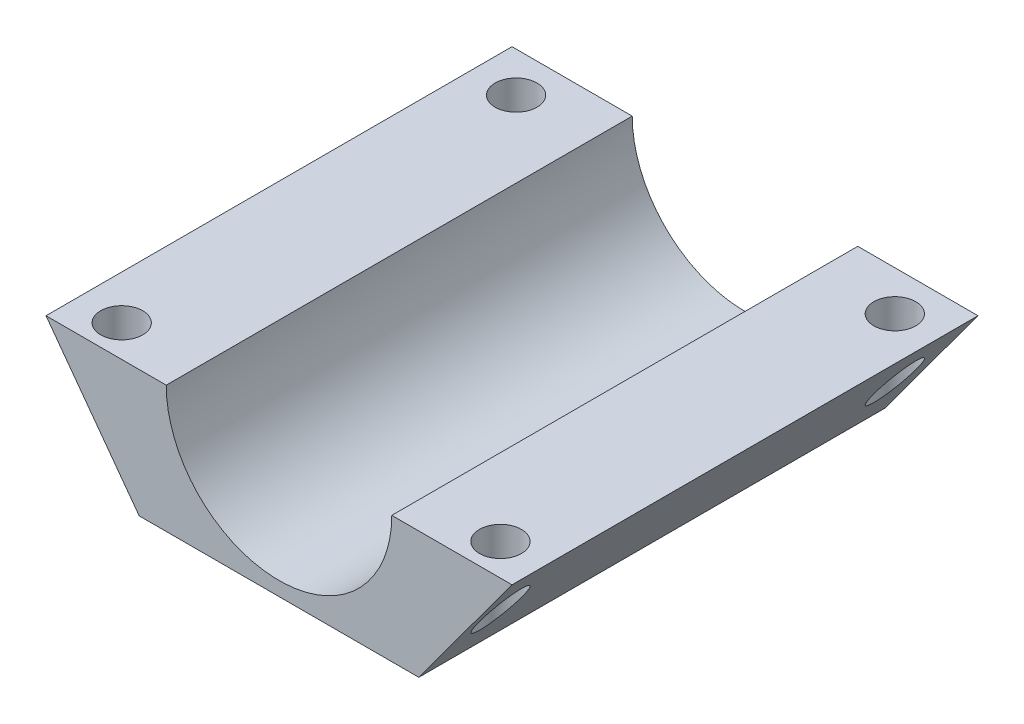
ISO-10303-21;
HEADER;
FILE_DESCRIPTION(('STEP AP214'),'2;1');
FILE_NAME('part.step','',(''),(''),'','','');
FILE_SCHEMA(('AUTOMOTIVE_DESIGN { 1 0 10303 214 1 1 1 1 }'));
ENDSEC;
DATA;
#1=APPLICATION_CONTEXT('core data for automotive mechanical design processes');
#2=APPLICATION_PROTOCOL_DEFINITION('international standard','automotive_design',2000,#1);
#3=PRODUCT_CONTEXT('',#1,'mechanical');
#4=PRODUCT('Part','Part','',(#3));
#5=PRODUCT_RELATED_PRODUCT_CATEGORY('part','',(#4));
#6=PRODUCT_DEFINITION_FORMATION('','',#4);
#7=PRODUCT_DEFINITION_CONTEXT('part definition',#1,'design');
#8=PRODUCT_DEFINITION('design','',#6,#7);
#9=PRODUCT_DEFINITION_SHAPE('','',#8);
#10=(LENGTH_UNIT() NAMED_UNIT(*) SI_UNIT(.MILLI.,.METRE.));
#11=(NAMED_UNIT(*) PLANE_ANGLE_UNIT() SI_UNIT($,.RADIAN.));
#12=(NAMED_UNIT(*) SI_UNIT($,.STERADIAN.) SOLID_ANGLE_UNIT());
#13=UNCERTAINTY_MEASURE_WITH_UNIT(LENGTH_MEASURE(1.E-05),#10,'distance_accuracy_value','');
#14=(GEOMETRIC_REPRESENTATION_CONTEXT(3) GLOBAL_UNCERTAINTY_ASSIGNED_CONTEXT((#13)) GLOBAL_UNIT_ASSIGNED_CONTEXT((#10,
#11,#12)) REPRESENTATION_CONTEXT('',''));
#15=CARTESIAN_POINT('',(0.,0.,0.));
#16=DIRECTION('',(0.,0.,1.));
#17=DIRECTION('',(1.,0.,0.));
#18=AXIS2_PLACEMENT_3D('',#15,#16,#17);
#19=CARTESIAN_POINT('',(0.,0.,0.));
#20=DIRECTION('',(0.,1.,0.));
#21=DIRECTION('',(-1.,0.,0.));
#22=AXIS2_PLACEMENT_3D('',#19,#20,#21);
#23=PLANE('',#22);
#24=CARTESIAN_POINT('',(-20.282339383463,0.,4.27991228451974));
#25=DIRECTION('',(0.,1.,0.));
#26=DIRECTION('',(-1.,0.,0.));
#27=AXIS2_PLACEMENT_3D('',#24,#25,#26);
#28=CIRCLE('',#27,2.25);
#29=CARTESIAN_POINT('',(-22.532339383463,0.,4.27991228451974));
#30=VERTEX_POINT('',#29);
#31=EDGE_CURVE('E127',#30,#30,#28,.F.);
#32=ORIENTED_EDGE('',*,*,#31,.T.);
#33=EDGE_LOOP('',(#32));
#34=FACE_BOUND('',#33,.T.);
#35=CARTESIAN_POINT('',(-20.282339383463,0.,46.5955843795144));
#36=DIRECTION('',(0.,1.,0.));
#37=DIRECTION('',(-1.,0.,0.));
#38=AXIS2_PLACEMENT_3D('',#35,#36,#37);
#39=CIRCLE('',#38,2.25);
#40=CARTESIAN_POINT('',(-22.532339383463,0.,46.5955843795144));
#41=VERTEX_POINT('',#40);
#42=EDGE_CURVE('E164',#41,#41,#39,.F.);
#43=ORIENTED_EDGE('',*,*,#42,.T.);
#44=EDGE_LOOP('',(#43));
#45=FACE_BOUND('',#44,.T.);
#46=DIRECTION('',(-1.,0.,0.));
#47=VECTOR('',#46,1.);
#48=CARTESIAN_POINT('',(0.,0.,50.));
#49=LINE('',#48,#47);
#50=CARTESIAN_POINT('',(-12.1,0.,50.));
#51=VERTEX_POINT('',#50);
#52=CARTESIAN_POINT('',(-25.,0.,50.));
#53=VERTEX_POINT('',#52);
#54=EDGE_CURVE('E156',#51,#53,#49,.T.);
#55=ORIENTED_EDGE('',*,*,#54,.F.);
#56=DIRECTION('',(0.,0.,-1.));
#57=VECTOR('',#56,1.);
#58=CARTESIAN_POINT('',(-12.1,0.,50.));
#59=LINE('',#58,#57);
#60=CARTESIAN_POINT('',(-12.1,0.,0.));
#61=VERTEX_POINT('',#60);
#62=EDGE_CURVE('E158',#61,#51,#59,.F.);
#63=ORIENTED_EDGE('',*,*,#62,.F.);
#64=DIRECTION('',(-1.,0.,0.));
#65=VECTOR('',#64,1.);
#66=CARTESIAN_POINT('',(0.,0.,0.));
#67=LINE('',#66,#65);
#68=CARTESIAN_POINT('',(-25.,0.,0.));
#69=VERTEX_POINT('',#68);
#70=EDGE_CURVE('E119',#61,#69,#67,.T.);
#71=ORIENTED_EDGE('',*,*,#70,.T.);
#72=DIRECTION('',(0.,0.,-1.));
#73=VECTOR('',#72,1.);
#74=CARTESIAN_POINT('',(-25.,0.,50.));
#75=LINE('',#74,#73);
#76=EDGE_CURVE('E60',#53,#69,#75,.T.);
#77=ORIENTED_EDGE('',*,*,#76,.F.);
#78=EDGE_LOOP('',(#55,#63,#71,#77));
#79=FACE_BOUND('',#78,.T.);
#80=ADVANCED_FACE('F41',(#34,#45,#79),#23,.T.);
#81=CARTESIAN_POINT('',(20.3552974387992,0.,4.27991228451974));
#82=DIRECTION('',(0.,1.,0.));
#83=DIRECTION('',(-1.,0.,0.));
#84=AXIS2_PLACEMENT_3D('',#81,#82,#83);
#85=CIRCLE('',#84,2.25);
#86=CARTESIAN_POINT('',(18.1052974387992,0.,4.27991228451974));
#87=VERTEX_POINT('',#86);
#88=EDGE_CURVE('E124',#87,#87,#85,.F.);
#89=ORIENTED_EDGE('',*,*,#88,.T.);
#90=EDGE_LOOP('',(#89));
#91=FACE_BOUND('',#90,.T.);
#92=CARTESIAN_POINT('',(20.3552974387992,0.,46.5955843795144));
#93=DIRECTION('',(0.,1.,0.));
#94=DIRECTION('',(-1.,0.,0.));
#95=AXIS2_PLACEMENT_3D('',#92,#93,#94);
#96=CIRCLE('',#95,2.25);
#97=CARTESIAN_POINT('',(18.1052974387992,0.,46.5955843795144));
#98=VERTEX_POINT('',#97);
#99=EDGE_CURVE('E161',#98,#98,#96,.F.);
#100=ORIENTED_EDGE('',*,*,#99,.T.);
#101=EDGE_LOOP('',(#100));
#102=FACE_BOUND('',#101,.T.);
#103=CARTESIAN_POINT('',(25.,0.,50.));
#104=VERTEX_POINT('',#103);
#105=CARTESIAN_POINT('',(12.1,0.,50.));
#106=VERTEX_POINT('',#105);
#107=EDGE_CURVE('E123',#104,#106,#49,.T.);
#108=ORIENTED_EDGE('',*,*,#107,.F.);
#109=DIRECTION('',(0.,0.,-1.));
#110=VECTOR('',#109,1.);
#111=CARTESIAN_POINT('',(25.,0.,50.));
#112=LINE('',#111,#110);
#113=CARTESIAN_POINT('',(25.,0.,0.));
#114=VERTEX_POINT('',#113);
#115=EDGE_CURVE('E105',#104,#114,#112,.T.);
#116=ORIENTED_EDGE('',*,*,#115,.T.);
#117=CARTESIAN_POINT('',(12.1,0.,0.));
#118=VERTEX_POINT('',#117);
#119=EDGE_CURVE('E112',#114,#118,#67,.T.);
#120=ORIENTED_EDGE('',*,*,#119,.T.);
#121=DIRECTION('',(0.,0.,-1.));
#122=VECTOR('',#121,1.);
#123=CARTESIAN_POINT('',(12.1,0.,50.));
#124=LINE('',#123,#122);
#125=EDGE_CURVE('E118',#106,#118,#124,.T.);
#126=ORIENTED_EDGE('',*,*,#125,.F.);
#127=EDGE_LOOP('',(#108,#116,#120,#126));
#128=FACE_BOUND('',#127,.T.);
#129=ADVANCED_FACE('F122',(#91,#102,#128),#23,.T.);
#130=CARTESIAN_POINT('',(0.,0.,50.));
#131=DIRECTION('',(0.,0.,-1.));
#132=DIRECTION('',(-1.,0.,0.));
#133=AXIS2_PLACEMENT_3D('',#130,#131,#132);
#134=CYLINDRICAL_SURFACE('',#133,12.1);
#135=CARTESIAN_POINT('',(0.,0.,50.));
#136=DIRECTION('',(0.,0.,1.));
#137=DIRECTION('',(1.,0.,0.));
#138=AXIS2_PLACEMENT_3D('',#135,#136,#137);
#139=CIRCLE('',#138,12.1);
#140=EDGE_CURVE('E130',#51,#106,#139,.T.);
#141=ORIENTED_EDGE('',*,*,#140,.T.);
#142=ORIENTED_EDGE('',*,*,#125,.T.);
#143=CARTESIAN_POINT('',(0.,0.,0.));
#144=DIRECTION('',(0.,0.,1.));
#145=DIRECTION('',(1.,0.,0.));
#146=AXIS2_PLACEMENT_3D('',#143,#144,#145);
#147=CIRCLE('',#146,12.1);
#148=EDGE_CURVE('E45',#61,#118,#147,.T.);
#149=ORIENTED_EDGE('',*,*,#148,.F.);
#150=ORIENTED_EDGE('',*,*,#62,.T.);
#151=EDGE_LOOP('',(#141,#142,#149,#150));
#152=FACE_BOUND('',#151,.T.);
#153=ADVANCED_FACE('F188',(#152),#134,.F.);
#154=CARTESIAN_POINT('',(0.,0.,50.));
#155=DIRECTION('',(0.,0.,1.));
#156=DIRECTION('',(1.,0.,0.));
#157=AXIS2_PLACEMENT_3D('',#154,#155,#156);
#158=PLANE('',#157);
#159=DIRECTION('',(0.592390450477518,0.805651012649425,0.));
#160=VECTOR('',#159,1.);
#161=CARTESIAN_POINT('',(16.2268388545761,-11.9314991577765,50.));
#162=LINE('',#161,#160);
#163=CARTESIAN_POINT('',(15.,-13.6,50.));
#164=VERTEX_POINT('',#163);
#165=EDGE_CURVE('E132',#164,#104,#162,.T.);
#166=ORIENTED_EDGE('',*,*,#165,.T.);
#167=ORIENTED_EDGE('',*,*,#107,.T.);
#168=ORIENTED_EDGE('',*,*,#140,.F.);
#169=ORIENTED_EDGE('',*,*,#54,.T.);
#170=DIRECTION('',(0.592390450477518,-0.805651012649425,0.));
#171=VECTOR('',#170,1.);
#172=CARTESIAN_POINT('',(-16.2268388545761,-11.9314991577765,50.));
#173=LINE('',#172,#171);
#174=CARTESIAN_POINT('',(-15.,-13.6,50.));
#175=VERTEX_POINT('',#174);
#176=EDGE_CURVE('E75',#53,#175,#173,.T.);
#177=ORIENTED_EDGE('',*,*,#176,.T.);
#178=DIRECTION('',(-1.,0.,0.));
#179=VECTOR('',#178,1.);
#180=CARTESIAN_POINT('',(0.,-13.6,50.));
#181=LINE('',#180,#179);
#182=EDGE_CURVE('E136',#164,#175,#181,.T.);
#183=ORIENTED_EDGE('',*,*,#182,.F.);
#184=EDGE_LOOP('',(#166,#167,#168,#169,#177,#183));
#185=FACE_BOUND('',#184,.T.);
#186=ADVANCED_FACE('F43',(#185),#158,.T.);
#187=CARTESIAN_POINT('',(0.,0.,0.));
#188=DIRECTION('',(0.,0.,1.));
#189=DIRECTION('',(1.,0.,0.));
#190=AXIS2_PLACEMENT_3D('',#187,#188,#189);
#191=PLANE('',#190);
#192=ORIENTED_EDGE('',*,*,#119,.F.);
#193=DIRECTION('',(0.592390450477518,0.805651012649425,0.));
#194=VECTOR('',#193,1.);
#195=CARTESIAN_POINT('',(16.2268388545761,-11.9314991577765,0.));
#196=LINE('',#195,#194);
#197=CARTESIAN_POINT('',(15.,-13.6,0.));
#198=VERTEX_POINT('',#197);
#199=EDGE_CURVE('E101',#198,#114,#196,.T.);
#200=ORIENTED_EDGE('',*,*,#199,.F.);
#201=DIRECTION('',(-1.,0.,0.));
#202=VECTOR('',#201,1.);
#203=CARTESIAN_POINT('',(0.,-13.6,0.));
#204=LINE('',#203,#202);
#205=CARTESIAN_POINT('',(-15.,-13.6,0.));
#206=VERTEX_POINT('',#205);
#207=EDGE_CURVE('E109',#198,#206,#204,.T.);
#208=ORIENTED_EDGE('',*,*,#207,.T.);
#209=DIRECTION('',(0.592390450477518,-0.805651012649425,0.));
#210=VECTOR('',#209,1.);
#211=CARTESIAN_POINT('',(-16.2268388545761,-11.9314991577765,0.));
#212=LINE('',#211,#210);
#213=EDGE_CURVE('E144',#69,#206,#212,.T.);
#214=ORIENTED_EDGE('',*,*,#213,.F.);
#215=ORIENTED_EDGE('',*,*,#70,.F.);
#216=ORIENTED_EDGE('',*,*,#148,.T.);
#217=EDGE_LOOP('',(#192,#200,#208,#214,#215,#216));
#218=FACE_BOUND('',#217,.T.);
#219=ADVANCED_FACE('F113',(#218),#191,.F.);
#220=CARTESIAN_POINT('',(20.3552974387992,-13.6,46.5955843795144));
#221=DIRECTION('',(0.,-1.,0.));
#222=DIRECTION('',(0.,0.,-1.));
#223=AXIS2_PLACEMENT_3D('',#220,#221,#222);
#224=CYLINDRICAL_SURFACE('',#223,2.25);
#225=CARTESIAN_POINT('',(20.3552974387992,-6.31679548323311,46.5955843795144));
#226=DIRECTION('',(-0.805651012649425,0.592390450477518,0.));
#227=DIRECTION('',(-0.592390450477518,-0.805651012649425,0.));
#228=AXIS2_PLACEMENT_3D('',#225,#226,#227);
#229=ELLIPSE('',#228,3.79817061228165,2.25);
#230=CARTESIAN_POINT('',(18.1052974387992,-9.3767954832331,46.5955843795144));
#231=VERTEX_POINT('',#230);
#232=EDGE_CURVE('E145',#231,#231,#229,.T.);
#233=ORIENTED_EDGE('',*,*,#232,.F.);
#234=EDGE_LOOP('',(#233));
#235=FACE_BOUND('',#234,.T.);
#236=ORIENTED_EDGE('',*,*,#99,.F.);
#237=EDGE_LOOP('',(#236));
#238=FACE_BOUND('',#237,.T.);
#239=ADVANCED_FACE('F184',(#235,#238),#224,.F.);
#240=CARTESIAN_POINT('',(-20.282339383463,-13.6,46.5955843795144));
#241=DIRECTION('',(0.,-1.,0.));
#242=DIRECTION('',(0.,0.,-1.));
#243=AXIS2_PLACEMENT_3D('',#240,#241,#242);
#244=CYLINDRICAL_SURFACE('',#243,2.25);
#245=CARTESIAN_POINT('',(-20.282339383463,-6.41601843849036,46.5955843795144));
#246=DIRECTION('',(0.805651012649425,0.592390450477518,0.));
#247=DIRECTION('',(0.592390450477518,-0.805651012649425,0.));
#248=AXIS2_PLACEMENT_3D('',#245,#246,#247);
#249=ELLIPSE('',#248,3.79817061228165,2.25);
#250=CARTESIAN_POINT('',(-18.032339383463,-9.47601843849035,46.5955843795144));
#251=VERTEX_POINT('',#250);
#252=EDGE_CURVE('E150',#251,#251,#249,.T.);
#253=ORIENTED_EDGE('',*,*,#252,.F.);
#254=EDGE_LOOP('',(#253));
#255=FACE_BOUND('',#254,.T.);
#256=ORIENTED_EDGE('',*,*,#42,.F.);
#257=EDGE_LOOP('',(#256));
#258=FACE_BOUND('',#257,.T.);
#259=ADVANCED_FACE('F174',(#255,#258),#244,.F.);
#260=CARTESIAN_POINT('',(-20.282339383463,-13.6,4.27991228451974));
#261=DIRECTION('',(0.,-1.,0.));
#262=DIRECTION('',(0.,0.,-1.));
#263=AXIS2_PLACEMENT_3D('',#260,#261,#262);
#264=CYLINDRICAL_SURFACE('',#263,2.25);
#265=CARTESIAN_POINT('',(-20.282339383463,-6.41601843849036,4.27991228451974));
#266=DIRECTION('',(0.805651012649425,0.592390450477518,0.));
#267=DIRECTION('',(0.592390450477518,-0.805651012649425,0.));
#268=AXIS2_PLACEMENT_3D('',#265,#266,#267);
#269=ELLIPSE('',#268,3.79817061228165,2.25);
#270=CARTESIAN_POINT('',(-18.032339383463,-9.47601843849035,4.27991228451974));
#271=VERTEX_POINT('',#270);
#272=EDGE_CURVE('E51',#271,#271,#269,.T.);
#273=ORIENTED_EDGE('',*,*,#272,.F.);
#274=EDGE_LOOP('',(#273));
#275=FACE_BOUND('',#274,.T.);
#276=ORIENTED_EDGE('',*,*,#31,.F.);
#277=EDGE_LOOP('',(#276));
#278=FACE_BOUND('',#277,.T.);
#279=ADVANCED_FACE('F171',(#275,#278),#264,.F.);
#280=CARTESIAN_POINT('',(20.3552974387992,-13.6,4.27991228451974));
#281=DIRECTION('',(0.,-1.,0.));
#282=DIRECTION('',(0.,0.,-1.));
#283=AXIS2_PLACEMENT_3D('',#280,#281,#282);
#284=CYLINDRICAL_SURFACE('',#283,2.25);
#285=CARTESIAN_POINT('',(20.3552974387992,-6.31679548323311,4.27991228451974));
#286=DIRECTION('',(-0.805651012649425,0.592390450477518,0.));
#287=DIRECTION('',(-0.592390450477518,-0.805651012649425,0.));
#288=AXIS2_PLACEMENT_3D('',#285,#286,#287);
#289=ELLIPSE('',#288,3.79817061228165,2.25);
#290=CARTESIAN_POINT('',(18.1052974387992,-9.3767954832331,4.27991228451974));
#291=VERTEX_POINT('',#290);
#292=EDGE_CURVE('E11',#291,#291,#289,.T.);
#293=ORIENTED_EDGE('',*,*,#292,.F.);
#294=EDGE_LOOP('',(#293));
#295=FACE_BOUND('',#294,.T.);
#296=ORIENTED_EDGE('',*,*,#88,.F.);
#297=EDGE_LOOP('',(#296));
#298=FACE_BOUND('',#297,.T.);
#299=ADVANCED_FACE('F173',(#295,#298),#284,.F.);
#300=CARTESIAN_POINT('',(-16.2268388545761,-11.9314991577765,50.));
#301=DIRECTION('',(0.805651012649425,0.592390450477518,0.));
#302=DIRECTION('',(-0.592390450477518,0.805651012649425,0.));
#303=AXIS2_PLACEMENT_3D('',#300,#301,#302);
#304=PLANE('',#303);
#305=ORIENTED_EDGE('',*,*,#272,.T.);
#306=EDGE_LOOP('',(#305));
#307=FACE_BOUND('',#306,.T.);
#308=ORIENTED_EDGE('',*,*,#252,.T.);
#309=EDGE_LOOP('',(#308));
#310=FACE_BOUND('',#309,.T.);
#311=ORIENTED_EDGE('',*,*,#213,.T.);
#312=DIRECTION('',(0.,0.,-1.));
#313=VECTOR('',#312,1.);
#314=CARTESIAN_POINT('',(-15.,-13.6,50.));
#315=LINE('',#314,#313);
#316=EDGE_CURVE('E138',#175,#206,#315,.T.);
#317=ORIENTED_EDGE('',*,*,#316,.F.);
#318=ORIENTED_EDGE('',*,*,#176,.F.);
#319=ORIENTED_EDGE('',*,*,#76,.T.);
#320=EDGE_LOOP('',(#311,#317,#318,#319));
#321=FACE_BOUND('',#320,.T.);
#322=ADVANCED_FACE('F181',(#307,#310,#321),#304,.F.);
#323=CARTESIAN_POINT('',(0.,-13.6,50.));
#324=DIRECTION('',(0.,-1.,0.));
#325=DIRECTION('',(1.,0.,0.));
#326=AXIS2_PLACEMENT_3D('',#323,#324,#325);
#327=PLANE('',#326);
#328=ORIENTED_EDGE('',*,*,#207,.F.);
#329=DIRECTION('',(0.,0.,-1.));
#330=VECTOR('',#329,1.);
#331=CARTESIAN_POINT('',(15.,-13.6,50.));
#332=LINE('',#331,#330);
#333=EDGE_CURVE('E83',#164,#198,#332,.T.);
#334=ORIENTED_EDGE('',*,*,#333,.F.);
#335=ORIENTED_EDGE('',*,*,#182,.T.);
#336=ORIENTED_EDGE('',*,*,#316,.T.);
#337=EDGE_LOOP('',(#328,#334,#335,#336));
#338=FACE_BOUND('',#337,.T.);
#339=ADVANCED_FACE('F212',(#338),#327,.T.);
#340=CARTESIAN_POINT('',(16.2268388545761,-11.9314991577765,50.));
#341=DIRECTION('',(-0.805651012649425,0.592390450477518,0.));
#342=DIRECTION('',(-0.592390450477518,-0.805651012649425,0.));
#343=AXIS2_PLACEMENT_3D('',#340,#341,#342);
#344=PLANE('',#343);
#345=ORIENTED_EDGE('',*,*,#292,.T.);
#346=EDGE_LOOP('',(#345));
#347=FACE_BOUND('',#346,.T.);
#348=ORIENTED_EDGE('',*,*,#232,.T.);
#349=EDGE_LOOP('',(#348));
#350=FACE_BOUND('',#349,.T.);
#351=ORIENTED_EDGE('',*,*,#199,.T.);
#352=ORIENTED_EDGE('',*,*,#115,.F.);
#353=ORIENTED_EDGE('',*,*,#165,.F.);
#354=ORIENTED_EDGE('',*,*,#333,.T.);
#355=EDGE_LOOP('',(#351,#352,#353,#354));
#356=FACE_BOUND('',#355,.T.);
#357=ADVANCED_FACE('F103',(#347,#350,#356),#344,.F.);
#358=CLOSED_SHELL('',(#80,#129,#153,#186,#219,#239,#259,#279,#299,#322,#339,#357));
#359=MANIFOLD_SOLID_BREP('B2',#358);
#360=ADVANCED_BREP_SHAPE_REPRESENTATION('',(#18,#359),#14);
#361=SHAPE_DEFINITION_REPRESENTATION(#9,#360);
ENDSEC;
END-ISO-10303-21;
